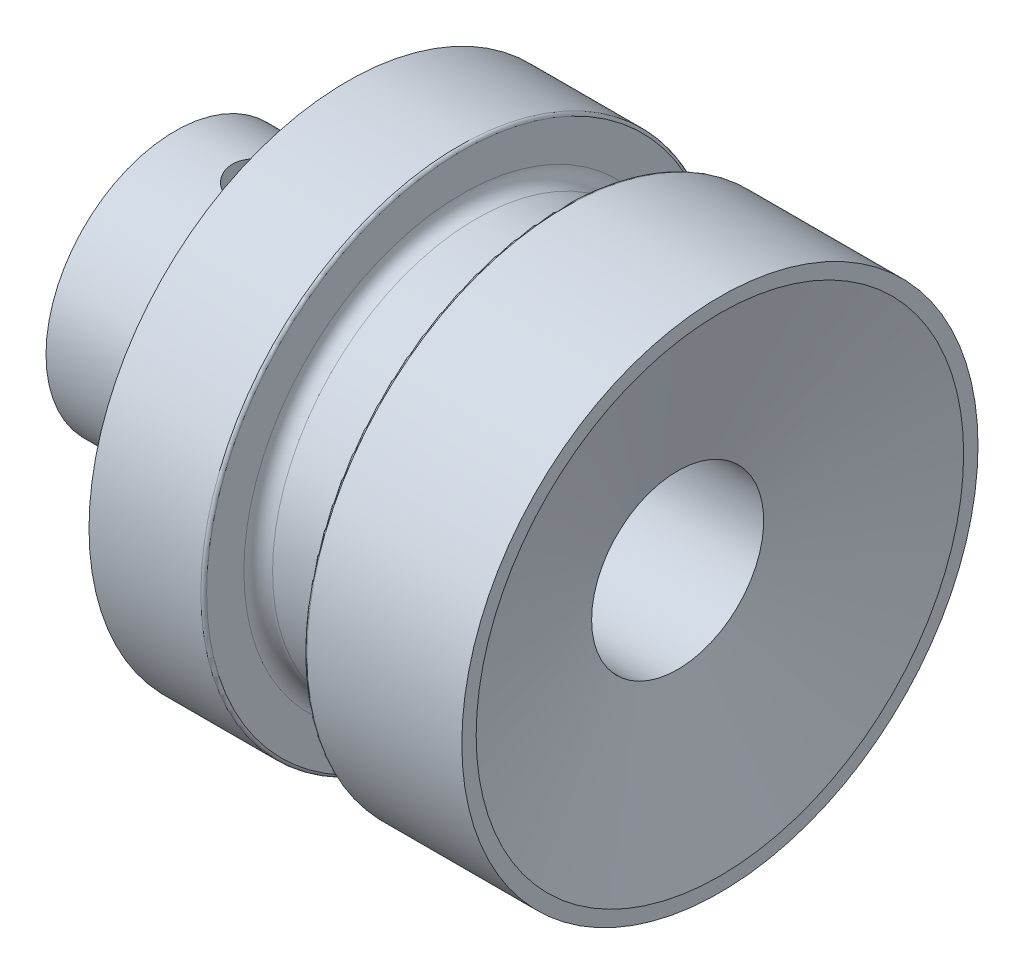
ISO-10303-21;
HEADER;
FILE_DESCRIPTION(('STEP AP214'),'2;1');
FILE_NAME('part.step','',(''),(''),'','','');
FILE_SCHEMA(('AUTOMOTIVE_DESIGN { 1 0 10303 214 1 1 1 1 }'));
ENDSEC;
DATA;
#1=APPLICATION_CONTEXT('core data for automotive mechanical design processes');
#2=APPLICATION_PROTOCOL_DEFINITION('international standard','automotive_design',2000,#1);
#3=PRODUCT_CONTEXT('',#1,'mechanical');
#4=PRODUCT('Part','Part','',(#3));
#5=PRODUCT_RELATED_PRODUCT_CATEGORY('part','',(#4));
#6=PRODUCT_DEFINITION_FORMATION('','',#4);
#7=PRODUCT_DEFINITION_CONTEXT('part definition',#1,'design');
#8=PRODUCT_DEFINITION('design','',#6,#7);
#9=PRODUCT_DEFINITION_SHAPE('','',#8);
#10=(LENGTH_UNIT() NAMED_UNIT(*) SI_UNIT(.MILLI.,.METRE.));
#11=(NAMED_UNIT(*) PLANE_ANGLE_UNIT() SI_UNIT($,.RADIAN.));
#12=(NAMED_UNIT(*) SI_UNIT($,.STERADIAN.) SOLID_ANGLE_UNIT());
#13=UNCERTAINTY_MEASURE_WITH_UNIT(LENGTH_MEASURE(1.E-05),#10,'distance_accuracy_value','');
#14=(GEOMETRIC_REPRESENTATION_CONTEXT(3) GLOBAL_UNCERTAINTY_ASSIGNED_CONTEXT((#13)) GLOBAL_UNIT_ASSIGNED_CONTEXT((#10,
#11,#12)) REPRESENTATION_CONTEXT('',''));
#15=CARTESIAN_POINT('',(0.,0.,0.));
#16=DIRECTION('',(0.,0.,1.));
#17=DIRECTION('',(1.,0.,0.));
#18=AXIS2_PLACEMENT_3D('',#15,#16,#17);
#19=CARTESIAN_POINT('',(0.,0.,0.));
#20=DIRECTION('',(-1.,0.,0.));
#21=DIRECTION('',(0.,0.,1.));
#22=AXIS2_PLACEMENT_3D('',#19,#20,#21);
#23=CYLINDRICAL_SURFACE('',#22,3.);
#24=CARTESIAN_POINT('',(3.,-2.82842712474619,1.));
#25=CARTESIAN_POINT('',(2.94553182518932,-2.82842694532734,1.0000002579478));
#26=CARTESIAN_POINT('',(2.89106520022848,-2.83001769372806,0.99553478369814));
#27=CARTESIAN_POINT('',(2.78374557904938,-2.83617574174579,0.977851131702564));
#28=CARTESIAN_POINT('',(2.73089285013606,-2.8407435316722,0.964631512170673));
#29=CARTESIAN_POINT('',(2.62837310698719,-2.85228203663887,0.929955485680262));
#30=CARTESIAN_POINT('',(2.57870007055312,-2.8592480396464,0.908515221402));
#31=CARTESIAN_POINT('',(2.48363995145621,-2.87479122017007,0.858061628442627));
#32=CARTESIAN_POINT('',(2.4382538174475,-2.88336875305432,0.829046628860522));
#33=CARTESIAN_POINT('',(2.35128003766051,-2.90154489405588,0.763051146442527));
#34=CARTESIAN_POINT('',(2.30988457132796,-2.91116894844138,0.725824341377825));
#35=CARTESIAN_POINT('',(2.23379319877568,-2.93013864801508,0.644987667214489));
#36=CARTESIAN_POINT('',(2.19909836841772,-2.93948424829098,0.601376775052402));
#37=CARTESIAN_POINT('',(2.13652110267032,-2.95713866921658,0.507604507964984));
#38=CARTESIAN_POINT('',(2.10884002938202,-2.96541407701568,0.457301911224518));
#39=CARTESIAN_POINT('',(2.06240841487251,-2.9796958677102,0.352431222987481));
#40=CARTESIAN_POINT('',(2.0436554668231,-2.98570286203011,0.297864285687214));
#41=CARTESIAN_POINT('',(2.0162641453676,-2.99459075431897,0.188028817433492));
#42=CARTESIAN_POINT('',(2.00729655374299,-2.99757314777557,0.132850754852967));
#43=CARTESIAN_POINT('',(1.99868370663934,-3.00043608218249,0.0216978748240909));
#44=CARTESIAN_POINT('',(1.99903604834758,-3.00031742262891,-0.034276733543893));
#45=CARTESIAN_POINT('',(2.00884425456603,-2.99706039618735,-0.143103515193818));
#46=CARTESIAN_POINT('',(2.01794252847451,-2.99404064755135,-0.195992048591667));
#47=CARTESIAN_POINT('',(2.04439298098045,-2.98546967339713,-0.299443438822161));
#48=CARTESIAN_POINT('',(2.06174571897976,-2.97991827631115,-0.350006137779175));
#49=CARTESIAN_POINT('',(2.10442131730613,-2.96675670293291,-0.448152474842013));
#50=CARTESIAN_POINT('',(2.12984593854678,-2.95912042524269,-0.495688220968998));
#51=CARTESIAN_POINT('',(2.18785970544839,-2.94258393038665,-0.585924325527169));
#52=CARTESIAN_POINT('',(2.22045084332664,-2.93368336200518,-0.628623334384769));
#53=CARTESIAN_POINT('',(2.29367439346074,-2.9150619185089,-0.710100866551906));
#54=CARTESIAN_POINT('',(2.33461315784544,-2.90532215172666,-0.748600157067555));
#55=CARTESIAN_POINT('',(2.42244872572266,-2.88647335245111,-0.818277259595889));
#56=CARTESIAN_POINT('',(2.46934644571324,-2.87736441731449,-0.849453943273004));
#57=CARTESIAN_POINT('',(2.56865362561542,-2.86070525135531,-0.903987455042732));
#58=CARTESIAN_POINT('',(2.62113213136781,-2.85317909338821,-0.927226463651049));
#59=CARTESIAN_POINT('',(2.72957139426626,-2.84081650878298,-0.964443193299506));
#60=CARTESIAN_POINT('',(2.78553068122182,-2.83597895501223,-0.978424795755529));
#61=CARTESIAN_POINT('',(2.89663835540062,-2.8297963630207,-0.996161282090474));
#62=CARTESIAN_POINT('',(2.95170942474572,-2.82830360315139,-1.00034909550575));
#63=CARTESIAN_POINT('',(3.06177614911704,-2.828566720628,-0.999605438911604));
#64=CARTESIAN_POINT('',(3.11677181602476,-2.83032200792767,-0.99467562522726));
#65=CARTESIAN_POINT('',(3.22315696571116,-2.83673618089378,-0.97622565155183));
#66=CARTESIAN_POINT('',(3.27460543015064,-2.84129325440593,-0.963006393980555));
#67=CARTESIAN_POINT('',(3.37454360623938,-2.85268553671269,-0.928713862560596));
#68=CARTESIAN_POINT('',(3.42303279159083,-2.85952114934906,-0.907639196363457));
#69=CARTESIAN_POINT('',(3.51738042084694,-2.87496877595717,-0.857474340738901));
#70=CARTESIAN_POINT('',(3.56310664264179,-2.88363025665609,-0.828151118358487));
#71=CARTESIAN_POINT('',(3.64914605238373,-2.90165768730983,-0.762585630557568));
#72=CARTESIAN_POINT('',(3.68945763866122,-2.91102384443799,-0.726341325498785));
#73=CARTESIAN_POINT('',(3.76552798409063,-2.92995038637843,-0.645891705900323));
#74=CARTESIAN_POINT('',(3.80097439001885,-2.93949843577895,-0.601387270546652));
#75=CARTESIAN_POINT('',(3.86391614234804,-2.9572685161311,-0.506827291400258));
#76=CARTESIAN_POINT('',(3.89141177116242,-2.96549059417695,-0.456771944864553));
#77=CARTESIAN_POINT('',(3.93742010486171,-2.97964405810602,-0.352779862432296));
#78=CARTESIAN_POINT('',(3.95599127714806,-2.98559030004531,-0.298871123321197));
#79=CARTESIAN_POINT('',(3.9837277420601,-2.99458610837774,-0.188458465846017));
#80=CARTESIAN_POINT('',(3.9928964298805,-2.99763672034018,-0.13195549195389));
#81=CARTESIAN_POINT('',(4.00126207760564,-3.00041863236257,-0.0208153358600411));
#82=CARTESIAN_POINT('',(4.00090745393238,-3.00029920089441,0.0337847239200186));
#83=CARTESIAN_POINT('',(3.99134269185359,-2.99712196519395,0.142111145000173));
#84=CARTESIAN_POINT('',(3.98213327184724,-2.99406439933567,0.195837576819055));
#85=CARTESIAN_POINT('',(3.95541776542403,-2.9854091495442,0.30004211943206));
#86=CARTESIAN_POINT('',(3.93804578464705,-2.97985258361179,0.350558270912795));
#87=CARTESIAN_POINT('',(3.89562246890286,-2.96677160704464,0.447978350939789));
#88=CARTESIAN_POINT('',(3.87056974480306,-2.959246840479,0.494881624142409));
#89=CARTESIAN_POINT('',(3.81243048789792,-2.94265868828,0.585634016308808));
#90=CARTESIAN_POINT('',(3.77908131461808,-2.93354872492381,0.629306251557695));
#91=CARTESIAN_POINT('',(3.70574260884409,-2.91492988791424,0.710581026272337));
#92=CARTESIAN_POINT('',(3.66575095773832,-2.90542088771397,0.748181621624258));
#93=CARTESIAN_POINT('',(3.57839064441196,-2.88663279827365,0.817741808833463));
#94=CARTESIAN_POINT('',(3.53079448901923,-2.87737727995344,0.849422965999216));
#95=CARTESIAN_POINT('',(3.43066557310135,-2.86060193316303,0.904314343299799));
#96=CARTESIAN_POINT('',(3.37813410698576,-2.85308165136169,0.927526776814558));
#97=CARTESIAN_POINT('',(3.27203817597617,-2.84101334230534,0.963843828206626));
#98=CARTESIAN_POINT('',(3.21862773643428,-2.83634632944799,0.977357909163267));
#99=CARTESIAN_POINT('',(3.11014394948453,-2.83005383613939,0.995434320161694));
#100=CARTESIAN_POINT('',(3.05507118256425,-2.82842730615135,0.999999739196501));
#101=CARTESIAN_POINT('',(3.,-2.82842712474619,1.));
#102=B_SPLINE_CURVE_WITH_KNOTS('',3,(#24,#25,#26,#27,#28,#29,#30,#31,#32,#33,#34,#35,#36,#37,
#38,#39,#40,#41,#42,#43,#44,#45,#46,#47,#48,#49,#50,#51,#52,#53,#54,#55,#56,#57,#58,#59,#60,#61,
#62,#63,#64,#65,#66,#67,#68,#69,#70,#71,#72,#73,#74,#75,#76,#77,#78,#79,#80,#81,#82,#83,#84,#85,
#86,#87,#88,#89,#90,#91,#92,#93,#94,#95,#96,#97,#98,#99,#100,#101),.UNSPECIFIED.,.T.,.F.,(4,2,2,
2,2,2,2,2,2,2,2,2,2,2,2,2,2,2,2,2,2,2,2,2,2,2,2,2,2,2,2,2,2,2,2,2,2,2,4),(0.,0.163200584775416,
0.32642805496888,0.489336627454544,0.652281166139158,0.821013374229397,0.989772651673595,
1.16293506139029,1.33605076382161,1.50314318760306,1.67019253297699,1.83069004820941,
1.99119844184608,2.15381654855707,2.31647991869394,2.48680174359289,2.65714979607478,
2.82992639837376,3.00263051349688,3.16754291357512,3.33242535830307,3.49164395761849,
3.65089079140019,3.81518857728788,3.979534856552,4.15178808164165,4.32403518750605,
4.49513791183924,4.66617882997229,4.82918084670708,4.99216964002854,5.15256956033503,
5.31299850756315,5.47935519513706,5.64576504425704,5.81868902729217,5.99156778259939,
6.15663212153686,6.32163947179229),.UNSPECIFIED.);
#103=CARTESIAN_POINT('',(3.,-2.82842712474619,1.));
#104=VERTEX_POINT('',#103);
#105=EDGE_CURVE('E81',#104,#104,#102,.T.);
#106=ORIENTED_EDGE('',*,*,#105,.T.);
#107=EDGE_LOOP('',(#106));
#108=FACE_BOUND('',#107,.T.);
#109=CARTESIAN_POINT('',(3.,2.82842712474619,1.));
#110=CARTESIAN_POINT('',(3.05446817481068,2.82842694532734,1.0000002579478));
#111=CARTESIAN_POINT('',(3.10893479977153,2.83001769372806,0.99553478369814));
#112=CARTESIAN_POINT('',(3.21625442095062,2.83617574174579,0.977851131702564));
#113=CARTESIAN_POINT('',(3.26910714986394,2.8407435316722,0.964631512170673));
#114=CARTESIAN_POINT('',(3.37162689301281,2.85228203663887,0.929955485680262));
#115=CARTESIAN_POINT('',(3.42129992944688,2.8592480396464,0.908515221402));
#116=CARTESIAN_POINT('',(3.51636004854379,2.87479122017007,0.858061628442627));
#117=CARTESIAN_POINT('',(3.5617461825525,2.88336875305432,0.829046628860522));
#118=CARTESIAN_POINT('',(3.64871996233949,2.90154489405588,0.763051146442527));
#119=CARTESIAN_POINT('',(3.69011542867204,2.91116894844138,0.725824341377825));
#120=CARTESIAN_POINT('',(3.76620680122432,2.93013864801508,0.644987667214489));
#121=CARTESIAN_POINT('',(3.80090163158228,2.93948424829098,0.601376775052402));
#122=CARTESIAN_POINT('',(3.86347889732968,2.95713866921658,0.507604507964984));
#123=CARTESIAN_POINT('',(3.89115997061798,2.96541407701568,0.457301911224518));
#124=CARTESIAN_POINT('',(3.93759158512749,2.9796958677102,0.352431222987481));
#125=CARTESIAN_POINT('',(3.9563445331769,2.98570286203011,0.297864285687214));
#126=CARTESIAN_POINT('',(3.9837358546324,2.99459075431897,0.188028817433492));
#127=CARTESIAN_POINT('',(3.99270344625701,2.99757314777557,0.132850754852967));
#128=CARTESIAN_POINT('',(4.00131629336066,3.00043608218249,0.021697874824091));
#129=CARTESIAN_POINT('',(4.00096395165242,3.00031742262891,-0.0342767335438931));
#130=CARTESIAN_POINT('',(3.99115574543397,2.99706039618735,-0.143103515193817));
#131=CARTESIAN_POINT('',(3.98205747152549,2.99404064755135,-0.195992048591667));
#132=CARTESIAN_POINT('',(3.95560701901955,2.98546967339713,-0.29944343882216));
#133=CARTESIAN_POINT('',(3.93825428102024,2.97991827631115,-0.350006137779175));
#134=CARTESIAN_POINT('',(3.89557868269387,2.96675670293291,-0.448152474842013));
#135=CARTESIAN_POINT('',(3.87015406145322,2.95912042524269,-0.495688220968998));
#136=CARTESIAN_POINT('',(3.81214029455161,2.94258393038665,-0.585924325527169));
#137=CARTESIAN_POINT('',(3.77954915667336,2.93368336200518,-0.628623334384769));
#138=CARTESIAN_POINT('',(3.70632560653926,2.9150619185089,-0.710100866551907));
#139=CARTESIAN_POINT('',(3.66538684215456,2.90532215172666,-0.748600157067556));
#140=CARTESIAN_POINT('',(3.57755127427734,2.88647335245111,-0.81827725959589));
#141=CARTESIAN_POINT('',(3.53065355428676,2.87736441731449,-0.849453943273004));
#142=CARTESIAN_POINT('',(3.43134637438459,2.86070525135531,-0.903987455042732));
#143=CARTESIAN_POINT('',(3.37886786863219,2.85317909338821,-0.927226463651049));
#144=CARTESIAN_POINT('',(3.27042860573374,2.84081650878298,-0.964443193299506));
#145=CARTESIAN_POINT('',(3.21446931877818,2.83597895501223,-0.978424795755529));
#146=CARTESIAN_POINT('',(3.10336164459938,2.8297963630207,-0.996161282090474));
#147=CARTESIAN_POINT('',(3.04829057525428,2.82830360315139,-1.00034909550575));
#148=CARTESIAN_POINT('',(2.93822385088296,2.828566720628,-0.999605438911604));
#149=CARTESIAN_POINT('',(2.88322818397524,2.83032200792767,-0.99467562522726));
#150=CARTESIAN_POINT('',(2.77684303428884,2.83673618089378,-0.97622565155183));
#151=CARTESIAN_POINT('',(2.72539456984936,2.84129325440593,-0.963006393980555));
#152=CARTESIAN_POINT('',(2.62545639376062,2.85268553671269,-0.928713862560596));
#153=CARTESIAN_POINT('',(2.57696720840917,2.85952114934906,-0.907639196363457));
#154=CARTESIAN_POINT('',(2.48261957915306,2.87496877595717,-0.857474340738901));
#155=CARTESIAN_POINT('',(2.43689335735821,2.88363025665609,-0.828151118358487));
#156=CARTESIAN_POINT('',(2.35085394761627,2.90165768730983,-0.762585630557568));
#157=CARTESIAN_POINT('',(2.31054236133878,2.91102384443799,-0.726341325498785));
#158=CARTESIAN_POINT('',(2.23447201590937,2.92995038637843,-0.645891705900323));
#159=CARTESIAN_POINT('',(2.19902560998115,2.93949843577895,-0.601387270546652));
#160=CARTESIAN_POINT('',(2.13608385765196,2.9572685161311,-0.506827291400258));
#161=CARTESIAN_POINT('',(2.10858822883758,2.96549059417695,-0.456771944864553));
#162=CARTESIAN_POINT('',(2.06257989513829,2.97964405810602,-0.352779862432296));
#163=CARTESIAN_POINT('',(2.04400872285194,2.98559030004531,-0.298871123321197));
#164=CARTESIAN_POINT('',(2.0162722579399,2.99458610837774,-0.188458465846017));
#165=CARTESIAN_POINT('',(2.0071035701195,2.99763672034018,-0.13195549195389));
#166=CARTESIAN_POINT('',(1.99873792239436,3.00041863236257,-0.0208153358600414));
#167=CARTESIAN_POINT('',(1.99909254606762,3.00029920089441,0.0337847239200183));
#168=CARTESIAN_POINT('',(2.00865730814641,2.99712196519395,0.142111145000173));
#169=CARTESIAN_POINT('',(2.01786672815276,2.99406439933567,0.195837576819054));
#170=CARTESIAN_POINT('',(2.04458223457597,2.9854091495442,0.30004211943206));
#171=CARTESIAN_POINT('',(2.06195421535295,2.97985258361179,0.350558270912794));
#172=CARTESIAN_POINT('',(2.10437753109714,2.96677160704464,0.447978350939789));
#173=CARTESIAN_POINT('',(2.12943025519694,2.959246840479,0.494881624142409));
#174=CARTESIAN_POINT('',(2.18756951210208,2.94265868828,0.585634016308808));
#175=CARTESIAN_POINT('',(2.22091868538192,2.93354872492381,0.629306251557695));
#176=CARTESIAN_POINT('',(2.29425739115591,2.91492988791424,0.710581026272337));
#177=CARTESIAN_POINT('',(2.33424904226168,2.90542088771397,0.748181621624258));
#178=CARTESIAN_POINT('',(2.42160935558803,2.88663279827365,0.817741808833463));
#179=CARTESIAN_POINT('',(2.46920551098077,2.87737727995344,0.849422965999216));
#180=CARTESIAN_POINT('',(2.56933442689865,2.86060193316303,0.904314343299799));
#181=CARTESIAN_POINT('',(2.62186589301424,2.85308165136169,0.927526776814558));
#182=CARTESIAN_POINT('',(2.72796182402383,2.84101334230534,0.963843828206626));
#183=CARTESIAN_POINT('',(2.78137226356572,2.83634632944799,0.977357909163267));
#184=CARTESIAN_POINT('',(2.88985605051547,2.83005383613939,0.995434320161694));
#185=CARTESIAN_POINT('',(2.94492881743575,2.82842730615135,0.999999739196501));
#186=CARTESIAN_POINT('',(3.,2.82842712474619,1.));
#187=B_SPLINE_CURVE_WITH_KNOTS('',3,(#109,#110,#111,#112,#113,#114,#115,#116,#117,#118,#119,
#120,#121,#122,#123,#124,#125,#126,#127,#128,#129,#130,#131,#132,#133,#134,#135,#136,#137,#138,
#139,#140,#141,#142,#143,#144,#145,#146,#147,#148,#149,#150,#151,#152,#153,#154,#155,#156,#157,
#158,#159,#160,#161,#162,#163,#164,#165,#166,#167,#168,#169,#170,#171,#172,#173,#174,#175,#176,
#177,#178,#179,#180,#181,#182,#183,#184,#185,#186),.UNSPECIFIED.,.T.,.F.,(4,2,2,2,2,2,2,2,2,2,2,
2,2,2,2,2,2,2,2,2,2,2,2,2,2,2,2,2,2,2,2,2,2,2,2,2,2,2,4),(0.,0.163200584775416,0.32642805496888,
0.489336627454544,0.652281166139158,0.821013374229397,0.989772651673595,1.16293506139029,
1.33605076382161,1.50314318760306,1.67019253297699,1.83069004820941,1.99119844184608,
2.15381654855707,2.31647991869394,2.48680174359289,2.65714979607477,2.82992639837376,
3.00263051349688,3.16754291357512,3.33242535830307,3.49164395761849,3.65089079140018,
3.81518857728788,3.979534856552,4.15178808164165,4.32403518750605,4.49513791183924,
4.66617882997229,4.82918084670708,4.99216964002854,5.15256956033502,5.31299850756315,
5.47935519513706,5.64576504425704,5.81868902729217,5.99156778259939,6.15663212153685,
6.32163947179229),.UNSPECIFIED.);
#188=CARTESIAN_POINT('',(3.,2.82842712474619,1.));
#189=VERTEX_POINT('',#188);
#190=EDGE_CURVE('E76',#189,#189,#187,.T.);
#191=ORIENTED_EDGE('',*,*,#190,.T.);
#192=EDGE_LOOP('',(#191));
#193=FACE_BOUND('',#192,.T.);
#194=CARTESIAN_POINT('',(17.5262794416288,0.,0.));
#195=DIRECTION('',(-1.,0.,0.));
#196=DIRECTION('',(0.,0.,1.));
#197=AXIS2_PLACEMENT_3D('',#194,#195,#196);
#198=CIRCLE('',#197,3.);
#199=CARTESIAN_POINT('',(17.5262794416288,0.,3.));
#200=VERTEX_POINT('',#199);
#201=EDGE_CURVE('E87',#200,#200,#198,.T.);
#202=ORIENTED_EDGE('',*,*,#201,.F.);
#203=EDGE_LOOP('',(#202));
#204=FACE_BOUND('',#203,.T.);
#205=CARTESIAN_POINT('',(0.,0.,0.));
#206=DIRECTION('',(-1.,0.,0.));
#207=DIRECTION('',(0.,0.,1.));
#208=AXIS2_PLACEMENT_3D('',#205,#206,#207);
#209=CIRCLE('',#208,2.99999999999999);
#210=CARTESIAN_POINT('',(0.,0.,2.99999999999999));
#211=VERTEX_POINT('',#210);
#212=EDGE_CURVE('E10',#211,#211,#209,.T.);
#213=ORIENTED_EDGE('',*,*,#212,.T.);
#214=EDGE_LOOP('',(#213));
#215=FACE_BOUND('',#214,.T.);
#216=ADVANCED_FACE('F34',(#108,#193,#204,#215),#23,.F.);
#217=CARTESIAN_POINT('',(0.,2.99999999999999,0.));
#218=DIRECTION('',(1.,0.,0.));
#219=DIRECTION('',(0.,0.,-1.));
#220=AXIS2_PLACEMENT_3D('',#217,#218,#219);
#221=PLANE('',#220);
#222=ORIENTED_EDGE('',*,*,#212,.F.);
#223=EDGE_LOOP('',(#222));
#224=FACE_BOUND('',#223,.T.);
#225=CARTESIAN_POINT('',(0.,0.,0.));
#226=DIRECTION('',(-1.,0.,0.));
#227=DIRECTION('',(0.,0.,1.));
#228=AXIS2_PLACEMENT_3D('',#225,#226,#227);
#229=CIRCLE('',#228,4.5);
#230=CARTESIAN_POINT('',(0.,0.,4.5));
#231=VERTEX_POINT('',#230);
#232=EDGE_CURVE('E47',#231,#231,#229,.T.);
#233=ORIENTED_EDGE('',*,*,#232,.T.);
#234=EDGE_LOOP('',(#233));
#235=FACE_BOUND('',#234,.T.);
#236=ADVANCED_FACE('F195',(#224,#235),#221,.F.);
#237=CARTESIAN_POINT('',(0.,0.,0.));
#238=DIRECTION('',(-1.,0.,0.));
#239=DIRECTION('',(0.,0.,1.));
#240=AXIS2_PLACEMENT_3D('',#237,#238,#239);
#241=CYLINDRICAL_SURFACE('',#240,4.5);
#242=CARTESIAN_POINT('',(3.,-4.38748219369606,1.));
#243=CARTESIAN_POINT('',(3.05542118384673,-4.38748331342391,0.999998124740785));
#244=CARTESIAN_POINT('',(3.11086470629648,-4.38854372765849,0.995377065735324));
#245=CARTESIAN_POINT('',(3.2201734130143,-4.39266269613714,0.97703611833839));
#246=CARTESIAN_POINT('',(3.27403745170201,-4.39572266492455,0.963309788508038));
#247=CARTESIAN_POINT('',(3.37859021114546,-4.40347746164853,0.927213191558881));
#248=CARTESIAN_POINT('',(3.42928240700305,-4.40817046205988,0.904852584002374));
#249=CARTESIAN_POINT('',(3.52619750352572,-4.41866033160417,0.852150017177229));
#250=CARTESIAN_POINT('',(3.5724204658707,-4.42445718549953,0.821808168079243));
#251=CARTESIAN_POINT('',(3.65989128568498,-4.43661451639959,0.753440537295431));
#252=CARTESIAN_POINT('',(3.70104988106007,-4.44298239912488,0.715301848896048));
#253=CARTESIAN_POINT('',(3.77644137621931,-4.45549951724043,0.632666839431873));
#254=CARTESIAN_POINT('',(3.81067372682177,-4.46164873526094,0.588170014707602));
#255=CARTESIAN_POINT('',(3.87159537569772,-4.47311646400737,0.493481972618769));
#256=CARTESIAN_POINT('',(3.89819862472658,-4.47842521703683,0.443234108266534));
#257=CARTESIAN_POINT('',(3.94254990086023,-4.48753012167776,0.338843167825976));
#258=CARTESIAN_POINT('',(3.9602989542355,-4.49132644858096,0.284700544003477));
#259=CARTESIAN_POINT('',(3.98615671646943,-4.49692642233618,0.174985398164167));
#260=CARTESIAN_POINT('',(3.9944165546002,-4.49876127463464,0.119450114130961));
#261=CARTESIAN_POINT('',(4.00153413543621,-4.50033974476022,0.00775382889301164));
#262=CARTESIAN_POINT('',(4.00039298696691,-4.50008360921472,-0.0484070977382725));
#263=CARTESIAN_POINT('',(3.98885313875198,-4.4975327467564,-0.158717960467174));
#264=CARTESIAN_POINT('',(3.97861736045445,-4.49527389802337,-0.212885892163576));
#265=CARTESIAN_POINT('',(3.94943866622242,-4.48901238651153,-0.318715422771708));
#266=CARTESIAN_POINT('',(3.93049534837337,-4.48500964324008,-0.370376905871404));
#267=CARTESIAN_POINT('',(3.88429651294953,-4.47565269302828,-0.470176884695465));
#268=CARTESIAN_POINT('',(3.85697964172778,-4.47028856276396,-0.518286010447011));
#269=CARTESIAN_POINT('',(3.7948549530255,-4.45879635842009,-0.609296568272403));
#270=CARTESIAN_POINT('',(3.76004608446502,-4.4526681771998,-0.652197268314768));
#271=CARTESIAN_POINT('',(3.68303990307352,-4.44016582863413,-0.732542494790414));
#272=CARTESIAN_POINT('',(3.64070001201458,-4.43378920480069,-0.769850109238106));
#273=CARTESIAN_POINT('',(3.55029862619146,-4.42163160720916,-0.836861515102731));
#274=CARTESIAN_POINT('',(3.50223696611286,-4.41585065067021,-0.866565086744066));
#275=CARTESIAN_POINT('',(3.40153005582566,-4.40553216782545,-0.91758882957986));
#276=CARTESIAN_POINT('',(3.34887088859767,-4.4009986024148,-0.93888238720365));
#277=CARTESIAN_POINT('',(3.24059691435886,-4.39374257045182,-0.97227634761584));
#278=CARTESIAN_POINT('',(3.18498259457134,-4.39101980634257,-0.984378260852373));
#279=CARTESIAN_POINT('',(3.07363000647013,-4.38775454247314,-0.998831494501015));
#280=CARTESIAN_POINT('',(3.01791893448007,-4.3871674012543,-1.00138249383898));
#281=CARTESIAN_POINT('',(2.90686753851872,-4.38811932262746,-0.997202737121733));
#282=CARTESIAN_POINT('',(2.85152718847078,-4.38965823406047,-0.990472640937895));
#283=CARTESIAN_POINT('',(2.74348823125171,-4.39464664137563,-0.968095186613481));
#284=CARTESIAN_POINT('',(2.69076551235185,-4.39807241834516,-0.952558463272168));
#285=CARTESIAN_POINT('',(2.58867168443566,-4.40642704252923,-0.913128875693618));
#286=CARTESIAN_POINT('',(2.53930090525027,-4.41135603739913,-0.889235190550064));
#287=CARTESIAN_POINT('',(2.44445019911179,-4.42225937025823,-0.833332350832739));
#288=CARTESIAN_POINT('',(2.39904434250747,-4.42824903821989,-0.801200572354219));
#289=CARTESIAN_POINT('',(2.31419582129565,-4.44055871006593,-0.729893521468862));
#290=CARTESIAN_POINT('',(2.27475392348571,-4.44687875628735,-0.690717344765467));
#291=CARTESIAN_POINT('',(2.2021743282457,-4.45928466963624,-0.605528607307309));
#292=CARTESIAN_POINT('',(2.16917298206527,-4.46536366365756,-0.559398704918137));
#293=CARTESIAN_POINT('',(2.11138793288299,-4.47647455721721,-0.462134081071294));
#294=CARTESIAN_POINT('',(2.08660383968328,-4.48150650647044,-0.410999597406531));
#295=CARTESIAN_POINT('',(2.0461449426833,-4.48992744359791,-0.305500950001647));
#296=CARTESIAN_POINT('',(2.03041140205292,-4.49332700109296,-0.251160194087202));
#297=CARTESIAN_POINT('',(2.00831741999173,-4.49814588349754,-0.140522543397796));
#298=CARTESIAN_POINT('',(2.00195556964307,-4.49956550606413,-0.0842259439625959));
#299=CARTESIAN_POINT('',(1.99885060881552,-4.50025537600146,0.027432422770189));
#300=CARTESIAN_POINT('',(2.00190418467039,-4.49957105615266,0.0827883528681088));
#301=CARTESIAN_POINT('',(2.01708747527836,-4.49622763231539,0.192177020683065));
#302=CARTESIAN_POINT('',(2.02921701654745,-4.49356856607353,0.246209783671607));
#303=CARTESIAN_POINT('',(2.06210917859742,-4.48657818532304,0.351255142393358));
#304=CARTESIAN_POINT('',(2.08284211195059,-4.48225262496609,0.40227744132041));
#305=CARTESIAN_POINT('',(2.13232390176949,-4.47239043658606,0.500145764046379));
#306=CARTESIAN_POINT('',(2.16107356308923,-4.46685368697546,0.546991367894834));
#307=CARTESIAN_POINT('',(2.22643113873243,-4.45503741308905,0.636165449755516));
#308=CARTESIAN_POINT('',(2.26318151784809,-4.44874549747429,0.678387879198455));
#309=CARTESIAN_POINT('',(2.34321106822281,-4.43619353584561,0.756135866174557));
#310=CARTESIAN_POINT('',(2.38649181788245,-4.42993349791575,0.791659799988316));
#311=CARTESIAN_POINT('',(2.47907724990508,-4.4180568509948,0.855479255716282));
#312=CARTESIAN_POINT('',(2.52845730841477,-4.41245039614391,0.883667429316083));
#313=CARTESIAN_POINT('',(2.63136844773064,-4.402644201522,0.931300131649453));
#314=CARTESIAN_POINT('',(2.6848960220652,-4.3984432890926,0.950751953872793));
#315=CARTESIAN_POINT('',(2.78205323701998,-4.39268810860696,0.976946747324326));
#316=CARTESIAN_POINT('',(2.82516171363364,-4.3907490225869,0.985574910239044));
#317=CARTESIAN_POINT('',(2.91217547829319,-4.38814565456081,0.997102130853924));
#318=CARTESIAN_POINT('',(2.95608072483999,-4.38748130635241,1.00000148607481));
#319=CARTESIAN_POINT('',(3.,-4.38748219369606,1.));
#320=B_SPLINE_CURVE_WITH_KNOTS('',3,(#242,#243,#244,#245,#246,#247,#248,#249,#250,#251,#252,
#253,#254,#255,#256,#257,#258,#259,#260,#261,#262,#263,#264,#265,#266,#267,#268,#269,#270,#271,
#272,#273,#274,#275,#276,#277,#278,#279,#280,#281,#282,#283,#284,#285,#286,#287,#288,#289,#290,
#291,#292,#293,#294,#295,#296,#297,#298,#299,#300,#301,#302,#303,#304,#305,#306,#307,#308,#309,
#310,#311,#312,#313,#314,#315,#316,#317,#318,#319),.UNSPECIFIED.,.T.,.F.,(4,2,2,2,2,2,2,2,2,2,2,
2,2,2,2,2,2,2,2,2,2,2,2,2,2,2,2,2,2,2,2,2,2,2,2,2,2,2,4),(0.,0.166102558494591,
0.332322750192435,0.498357520008391,0.664389998050727,0.833022969567701,1.00166930675099,
1.17214906318353,1.34260905508582,1.51031485736443,1.67800087939989,1.84274220917405,
2.00749114368964,2.17347729000196,2.33948673831992,2.50906023645939,2.67863863513816,
2.84874944722111,3.01883229921634,3.18533874755266,3.35183335815117,3.51628128972296,
3.68074537959259,3.84781614360498,4.01490836999235,4.18522523018715,4.35553400169376,
4.52472464724766,4.6938898544815,4.85942793779578,5.02496285698629,5.18993125886616,
5.35491622901636,5.52312234724343,5.69136918646788,5.86195485764065,6.03239785047427,
6.16403493145229,6.29566517579135),.UNSPECIFIED.);
#321=CARTESIAN_POINT('',(3.,-4.38748219369606,1.));
#322=VERTEX_POINT('',#321);
#323=EDGE_CURVE('E38',#322,#322,#320,.T.);
#324=ORIENTED_EDGE('',*,*,#323,.T.);
#325=EDGE_LOOP('',(#324));
#326=FACE_BOUND('',#325,.T.);
#327=CARTESIAN_POINT('',(3.,4.38748219369606,1.));
#328=CARTESIAN_POINT('',(2.94457881615327,4.38748331342391,0.999998124740785));
#329=CARTESIAN_POINT('',(2.88913529370352,4.38854372765849,0.995377065735324));
#330=CARTESIAN_POINT('',(2.7798265869857,4.39266269613714,0.97703611833839));
#331=CARTESIAN_POINT('',(2.725962548298,4.39572266492455,0.963309788508038));
#332=CARTESIAN_POINT('',(2.62140978885454,4.40347746164853,0.927213191558881));
#333=CARTESIAN_POINT('',(2.57071759299695,4.40817046205988,0.904852584002374));
#334=CARTESIAN_POINT('',(2.47380249647428,4.41866033160417,0.852150017177229));
#335=CARTESIAN_POINT('',(2.4275795341293,4.42445718549954,0.821808168079242));
#336=CARTESIAN_POINT('',(2.34010871431502,4.43661451639959,0.753440537295431));
#337=CARTESIAN_POINT('',(2.29895011893993,4.44298239912488,0.715301848896048));
#338=CARTESIAN_POINT('',(2.22355862378069,4.45549951724043,0.632666839431873));
#339=CARTESIAN_POINT('',(2.18932627317823,4.46164873526093,0.588170014707602));
#340=CARTESIAN_POINT('',(2.12840462430228,4.47311646400737,0.493481972618769));
#341=CARTESIAN_POINT('',(2.10180137527342,4.47842521703683,0.443234108266534));
#342=CARTESIAN_POINT('',(2.05745009913977,4.48753012167776,0.338843167825975));
#343=CARTESIAN_POINT('',(2.0397010457645,4.49132644858096,0.284700544003477));
#344=CARTESIAN_POINT('',(2.01384328353057,4.49692642233618,0.174985398164166));
#345=CARTESIAN_POINT('',(2.0055834453998,4.49876127463464,0.119450114130961));
#346=CARTESIAN_POINT('',(1.99846586456379,4.50033974476022,0.00775382889301179));
#347=CARTESIAN_POINT('',(1.99960701303309,4.50008360921472,-0.0484070977382724));
#348=CARTESIAN_POINT('',(2.01114686124802,4.4975327467564,-0.158717960467173));
#349=CARTESIAN_POINT('',(2.02138263954555,4.49527389802337,-0.212885892163576));
#350=CARTESIAN_POINT('',(2.05056133377758,4.48901238651153,-0.318715422771708));
#351=CARTESIAN_POINT('',(2.06950465162663,4.48500964324008,-0.370376905871404));
#352=CARTESIAN_POINT('',(2.11570348705047,4.47565269302828,-0.470176884695466));
#353=CARTESIAN_POINT('',(2.14302035827222,4.47028856276396,-0.518286010447011));
#354=CARTESIAN_POINT('',(2.2051450469745,4.45879635842009,-0.609296568272403));
#355=CARTESIAN_POINT('',(2.23995391553498,4.4526681771998,-0.652197268314768));
#356=CARTESIAN_POINT('',(2.31696009692648,4.44016582863413,-0.732542494790414));
#357=CARTESIAN_POINT('',(2.35929998798542,4.43378920480069,-0.769850109238106));
#358=CARTESIAN_POINT('',(2.44970137380854,4.42163160720916,-0.836861515102731));
#359=CARTESIAN_POINT('',(2.49776303388714,4.41585065067021,-0.866565086744066));
#360=CARTESIAN_POINT('',(2.59846994417434,4.40553216782545,-0.91758882957986));
#361=CARTESIAN_POINT('',(2.65112911140233,4.4009986024148,-0.93888238720365));
#362=CARTESIAN_POINT('',(2.75940308564114,4.39374257045182,-0.97227634761584));
#363=CARTESIAN_POINT('',(2.81501740542866,4.39101980634257,-0.984378260852373));
#364=CARTESIAN_POINT('',(2.92636999352987,4.38775454247314,-0.998831494501015));
#365=CARTESIAN_POINT('',(2.98208106551993,4.3871674012543,-1.00138249383898));
#366=CARTESIAN_POINT('',(3.09313246148128,4.38811932262746,-0.997202737121733));
#367=CARTESIAN_POINT('',(3.14847281152922,4.38965823406047,-0.990472640937895));
#368=CARTESIAN_POINT('',(3.25651176874829,4.39464664137563,-0.968095186613481));
#369=CARTESIAN_POINT('',(3.30923448764815,4.39807241834516,-0.952558463272168));
#370=CARTESIAN_POINT('',(3.41132831556434,4.40642704252923,-0.913128875693618));
#371=CARTESIAN_POINT('',(3.46069909474973,4.41135603739913,-0.889235190550063));
#372=CARTESIAN_POINT('',(3.55554980088821,4.42225937025823,-0.833332350832739));
#373=CARTESIAN_POINT('',(3.60095565749253,4.42824903821989,-0.801200572354218));
#374=CARTESIAN_POINT('',(3.68580417870435,4.44055871006593,-0.729893521468861));
#375=CARTESIAN_POINT('',(3.72524607651429,4.44687875628735,-0.690717344765467));
#376=CARTESIAN_POINT('',(3.7978256717543,4.45928466963624,-0.605528607307309));
#377=CARTESIAN_POINT('',(3.83082701793473,4.46536366365756,-0.559398704918137));
#378=CARTESIAN_POINT('',(3.88861206711701,4.47647455721721,-0.462134081071294));
#379=CARTESIAN_POINT('',(3.91339616031672,4.48150650647044,-0.410999597406531));
#380=CARTESIAN_POINT('',(3.9538550573167,4.48992744359791,-0.305500950001647));
#381=CARTESIAN_POINT('',(3.96958859794708,4.49332700109296,-0.251160194087202));
#382=CARTESIAN_POINT('',(3.99168258000827,4.49814588349754,-0.140522543397796));
#383=CARTESIAN_POINT('',(3.99804443035693,4.49956550606413,-0.084225943962596));
#384=CARTESIAN_POINT('',(4.00114939118448,4.50025537600146,0.0274324227701888));
#385=CARTESIAN_POINT('',(3.99809581532961,4.49957105615266,0.0827883528681086));
#386=CARTESIAN_POINT('',(3.98291252472164,4.49622763231539,0.192177020683065));
#387=CARTESIAN_POINT('',(3.97078298345254,4.49356856607353,0.246209783671607));
#388=CARTESIAN_POINT('',(3.93789082140258,4.48657818532304,0.351255142393358));
#389=CARTESIAN_POINT('',(3.91715788804941,4.48225262496609,0.40227744132041));
#390=CARTESIAN_POINT('',(3.86767609823051,4.47239043658606,0.500145764046379));
#391=CARTESIAN_POINT('',(3.83892643691077,4.46685368697546,0.546991367894834));
#392=CARTESIAN_POINT('',(3.77356886126757,4.45503741308905,0.636165449755516));
#393=CARTESIAN_POINT('',(3.73681848215191,4.44874549747429,0.678387879198455));
#394=CARTESIAN_POINT('',(3.65678893177719,4.43619353584561,0.756135866174557));
#395=CARTESIAN_POINT('',(3.61350818211755,4.42993349791575,0.791659799988316));
#396=CARTESIAN_POINT('',(3.52092275009492,4.4180568509948,0.855479255716282));
#397=CARTESIAN_POINT('',(3.47154269158522,4.41245039614391,0.883667429316083));
#398=CARTESIAN_POINT('',(3.36863155226936,4.402644201522,0.931300131649453));
#399=CARTESIAN_POINT('',(3.3151039779348,4.3984432890926,0.950751953872793));
#400=CARTESIAN_POINT('',(3.21794676298002,4.39268810860696,0.976946747324326));
#401=CARTESIAN_POINT('',(3.17483828636636,4.3907490225869,0.985574910239044));
#402=CARTESIAN_POINT('',(3.08782452170681,4.38814565456081,0.997102130853923));
#403=CARTESIAN_POINT('',(3.04391927516001,4.38748130635241,1.00000148607481));
#404=CARTESIAN_POINT('',(3.,4.38748219369606,1.));
#405=B_SPLINE_CURVE_WITH_KNOTS('',3,(#327,#328,#329,#330,#331,#332,#333,#334,#335,#336,#337,
#338,#339,#340,#341,#342,#343,#344,#345,#346,#347,#348,#349,#350,#351,#352,#353,#354,#355,#356,
#357,#358,#359,#360,#361,#362,#363,#364,#365,#366,#367,#368,#369,#370,#371,#372,#373,#374,#375,
#376,#377,#378,#379,#380,#381,#382,#383,#384,#385,#386,#387,#388,#389,#390,#391,#392,#393,#394,
#395,#396,#397,#398,#399,#400,#401,#402,#403,#404),.UNSPECIFIED.,.T.,.F.,(4,2,2,2,2,2,2,2,2,2,2,
2,2,2,2,2,2,2,2,2,2,2,2,2,2,2,2,2,2,2,2,2,2,2,2,2,2,2,4),(0.,0.16610255849459,0.332322750192435,
0.498357520008392,0.664389998050727,0.833022969567701,1.00166930675099,1.17214906318353,
1.34260905508582,1.51031485736443,1.67800087939989,1.84274220917405,2.00749114368964,
2.17347729000196,2.33948673831992,2.50906023645939,2.67863863513816,2.84874944722111,
3.01883229921634,3.18533874755265,3.35183335815117,3.51628128972296,3.68074537959259,
3.84781614360498,4.01490836999235,4.18522523018715,4.35553400169376,4.52472464724766,
4.6938898544815,4.85942793779578,5.02496285698629,5.18993125886616,5.35491622901636,
5.52312234724343,5.69136918646788,5.86195485764065,6.03239785047427,6.16403493145229,
6.29566517579135),.UNSPECIFIED.);
#406=CARTESIAN_POINT('',(3.,4.38748219369606,1.));
#407=VERTEX_POINT('',#406);
#408=EDGE_CURVE('E55',#407,#407,#405,.T.);
#409=ORIENTED_EDGE('',*,*,#408,.T.);
#410=EDGE_LOOP('',(#409));
#411=FACE_BOUND('',#410,.T.);
#412=ORIENTED_EDGE('',*,*,#232,.F.);
#413=EDGE_LOOP('',(#412));
#414=FACE_BOUND('',#413,.T.);
#415=CARTESIAN_POINT('',(6.,0.,0.));
#416=DIRECTION('',(-1.,0.,0.));
#417=DIRECTION('',(0.,0.,1.));
#418=AXIS2_PLACEMENT_3D('',#415,#416,#417);
#419=CIRCLE('',#418,4.5);
#420=CARTESIAN_POINT('',(6.,0.,4.5));
#421=VERTEX_POINT('',#420);
#422=EDGE_CURVE('E52',#421,#421,#419,.T.);
#423=ORIENTED_EDGE('',*,*,#422,.T.);
#424=EDGE_LOOP('',(#423));
#425=FACE_BOUND('',#424,.T.);
#426=ADVANCED_FACE('F60',(#326,#411,#414,#425),#241,.T.);
#427=CARTESIAN_POINT('',(6.,4.5,0.));
#428=DIRECTION('',(1.,0.,0.));
#429=DIRECTION('',(0.,0.,-1.));
#430=AXIS2_PLACEMENT_3D('',#427,#428,#429);
#431=PLANE('',#430);
#432=ORIENTED_EDGE('',*,*,#422,.F.);
#433=EDGE_LOOP('',(#432));
#434=FACE_BOUND('',#433,.T.);
#435=CARTESIAN_POINT('',(6.,0.,0.));
#436=DIRECTION('',(-1.,0.,0.));
#437=DIRECTION('',(0.,0.,1.));
#438=AXIS2_PLACEMENT_3D('',#435,#436,#437);
#439=CIRCLE('',#438,9.);
#440=CARTESIAN_POINT('',(6.,0.,9.));
#441=VERTEX_POINT('',#440);
#442=EDGE_CURVE('E120',#441,#441,#439,.T.);
#443=ORIENTED_EDGE('',*,*,#442,.T.);
#444=EDGE_LOOP('',(#443));
#445=FACE_BOUND('',#444,.T.);
#446=ADVANCED_FACE('F126',(#434,#445),#431,.F.);
#447=CARTESIAN_POINT('',(0.,0.,0.));
#448=DIRECTION('',(-1.,0.,0.));
#449=DIRECTION('',(0.,0.,1.));
#450=AXIS2_PLACEMENT_3D('',#447,#448,#449);
#451=CYLINDRICAL_SURFACE('',#450,9.);
#452=ORIENTED_EDGE('',*,*,#442,.F.);
#453=EDGE_LOOP('',(#452));
#454=FACE_BOUND('',#453,.T.);
#455=CARTESIAN_POINT('',(9.9,0.,0.));
#456=DIRECTION('',(-1.,0.,0.));
#457=DIRECTION('',(0.,0.,1.));
#458=AXIS2_PLACEMENT_3D('',#455,#456,#457);
#459=CIRCLE('',#458,9.);
#460=CARTESIAN_POINT('',(9.9,0.,9.));
#461=VERTEX_POINT('',#460);
#462=EDGE_CURVE('E117',#461,#461,#459,.T.);
#463=ORIENTED_EDGE('',*,*,#462,.T.);
#464=EDGE_LOOP('',(#463));
#465=FACE_BOUND('',#464,.T.);
#466=ADVANCED_FACE('F129',(#454,#465),#451,.T.);
#467=CARTESIAN_POINT('',(9.9,0.,0.));
#468=DIRECTION('',(-1.,0.,0.));
#469=DIRECTION('',(0.,0.,1.));
#470=AXIS2_PLACEMENT_3D('',#467,#468,#469);
#471=TOROIDAL_SURFACE('',#470,8.9,0.0999999999999994);
#472=ORIENTED_EDGE('',*,*,#462,.F.);
#473=EDGE_LOOP('',(#472));
#474=FACE_BOUND('',#473,.T.);
#475=CARTESIAN_POINT('',(10.,0.,0.));
#476=DIRECTION('',(-1.,0.,0.));
#477=DIRECTION('',(0.,0.,1.));
#478=AXIS2_PLACEMENT_3D('',#475,#476,#477);
#479=CIRCLE('',#478,8.9);
#480=CARTESIAN_POINT('',(10.,0.,8.9));
#481=VERTEX_POINT('',#480);
#482=EDGE_CURVE('E114',#481,#481,#479,.T.);
#483=ORIENTED_EDGE('',*,*,#482,.T.);
#484=EDGE_LOOP('',(#483));
#485=FACE_BOUND('',#484,.T.);
#486=ADVANCED_FACE('F134',(#474,#485),#471,.T.);
#487=CARTESIAN_POINT('',(10.,8.9,0.));
#488=DIRECTION('',(-1.,0.,0.));
#489=DIRECTION('',(0.,0.,1.));
#490=AXIS2_PLACEMENT_3D('',#487,#488,#489);
#491=PLANE('',#490);
#492=ORIENTED_EDGE('',*,*,#482,.F.);
#493=EDGE_LOOP('',(#492));
#494=FACE_BOUND('',#493,.T.);
#495=CARTESIAN_POINT('',(10.,0.,0.));
#496=DIRECTION('',(-1.,0.,0.));
#497=DIRECTION('',(0.,0.,1.));
#498=AXIS2_PLACEMENT_3D('',#495,#496,#497);
#499=CIRCLE('',#498,7.6);
#500=CARTESIAN_POINT('',(10.,0.,7.6));
#501=VERTEX_POINT('',#500);
#502=EDGE_CURVE('E111',#501,#501,#499,.T.);
#503=ORIENTED_EDGE('',*,*,#502,.T.);
#504=EDGE_LOOP('',(#503));
#505=FACE_BOUND('',#504,.T.);
#506=ADVANCED_FACE('F140',(#494,#505),#491,.F.);
#507=CARTESIAN_POINT('',(10.5,0.,0.));
#508=DIRECTION('',(-1.,0.,0.));
#509=DIRECTION('',(0.,0.,1.));
#510=AXIS2_PLACEMENT_3D('',#507,#508,#509);
#511=TOROIDAL_SURFACE('',#510,7.6,0.5);
#512=ORIENTED_EDGE('',*,*,#502,.F.);
#513=EDGE_LOOP('',(#512));
#514=FACE_BOUND('',#513,.T.);
#515=CARTESIAN_POINT('',(10.5,0.,0.));
#516=DIRECTION('',(-1.,0.,0.));
#517=DIRECTION('',(0.,0.,1.));
#518=AXIS2_PLACEMENT_3D('',#515,#516,#517);
#519=CIRCLE('',#518,7.1);
#520=CARTESIAN_POINT('',(10.5,0.,7.1));
#521=VERTEX_POINT('',#520);
#522=EDGE_CURVE('E108',#521,#521,#519,.T.);
#523=ORIENTED_EDGE('',*,*,#522,.T.);
#524=EDGE_LOOP('',(#523));
#525=FACE_BOUND('',#524,.T.);
#526=ADVANCED_FACE('F146',(#514,#525),#511,.F.);
#527=CARTESIAN_POINT('',(0.,0.,0.));
#528=DIRECTION('',(-1.,0.,0.));
#529=DIRECTION('',(0.,0.,1.));
#530=AXIS2_PLACEMENT_3D('',#527,#528,#529);
#531=CYLINDRICAL_SURFACE('',#530,7.1);
#532=ORIENTED_EDGE('',*,*,#522,.F.);
#533=EDGE_LOOP('',(#532));
#534=FACE_BOUND('',#533,.T.);
#535=CARTESIAN_POINT('',(13.,0.,0.));
#536=DIRECTION('',(-1.,0.,0.));
#537=DIRECTION('',(0.,0.,1.));
#538=AXIS2_PLACEMENT_3D('',#535,#536,#537);
#539=CIRCLE('',#538,7.1);
#540=CARTESIAN_POINT('',(13.,0.,7.1));
#541=VERTEX_POINT('',#540);
#542=EDGE_CURVE('E105',#541,#541,#539,.T.);
#543=ORIENTED_EDGE('',*,*,#542,.T.);
#544=EDGE_LOOP('',(#543));
#545=FACE_BOUND('',#544,.T.);
#546=ADVANCED_FACE('F152',(#534,#545),#531,.T.);
#547=CARTESIAN_POINT('',(13.,0.,0.));
#548=DIRECTION('',(-1.,0.,0.));
#549=DIRECTION('',(0.,0.,1.));
#550=AXIS2_PLACEMENT_3D('',#547,#548,#549);
#551=TOROIDAL_SURFACE('',#550,7.6,0.5);
#552=ORIENTED_EDGE('',*,*,#542,.F.);
#553=EDGE_LOOP('',(#552));
#554=FACE_BOUND('',#553,.T.);
#555=CARTESIAN_POINT('',(13.5,0.,0.));
#556=DIRECTION('',(-1.,0.,0.));
#557=DIRECTION('',(0.,0.,1.));
#558=AXIS2_PLACEMENT_3D('',#555,#556,#557);
#559=CIRCLE('',#558,7.6);
#560=CARTESIAN_POINT('',(13.5,0.,7.6));
#561=VERTEX_POINT('',#560);
#562=EDGE_CURVE('E102',#561,#561,#559,.T.);
#563=ORIENTED_EDGE('',*,*,#562,.T.);
#564=EDGE_LOOP('',(#563));
#565=FACE_BOUND('',#564,.T.);
#566=ADVANCED_FACE('F158',(#554,#565),#551,.F.);
#567=CARTESIAN_POINT('',(13.5,7.6,0.));
#568=DIRECTION('',(1.,0.,0.));
#569=DIRECTION('',(0.,0.,-1.));
#570=AXIS2_PLACEMENT_3D('',#567,#568,#569);
#571=PLANE('',#570);
#572=ORIENTED_EDGE('',*,*,#562,.F.);
#573=EDGE_LOOP('',(#572));
#574=FACE_BOUND('',#573,.T.);
#575=CARTESIAN_POINT('',(13.5,0.,0.));
#576=DIRECTION('',(-1.,0.,0.));
#577=DIRECTION('',(0.,0.,1.));
#578=AXIS2_PLACEMENT_3D('',#575,#576,#577);
#579=CIRCLE('',#578,8.9);
#580=CARTESIAN_POINT('',(13.5,0.,8.9));
#581=VERTEX_POINT('',#580);
#582=EDGE_CURVE('E99',#581,#581,#579,.T.);
#583=ORIENTED_EDGE('',*,*,#582,.T.);
#584=EDGE_LOOP('',(#583));
#585=FACE_BOUND('',#584,.T.);
#586=ADVANCED_FACE('F164',(#574,#585),#571,.F.);
#587=CARTESIAN_POINT('',(13.6,0.,0.));
#588=DIRECTION('',(-1.,0.,0.));
#589=DIRECTION('',(0.,0.,1.));
#590=AXIS2_PLACEMENT_3D('',#587,#588,#589);
#591=TOROIDAL_SURFACE('',#590,8.9,0.0999999999999994);
#592=ORIENTED_EDGE('',*,*,#582,.F.);
#593=EDGE_LOOP('',(#592));
#594=FACE_BOUND('',#593,.T.);
#595=CARTESIAN_POINT('',(13.6,0.,0.));
#596=DIRECTION('',(-1.,0.,0.));
#597=DIRECTION('',(0.,0.,1.));
#598=AXIS2_PLACEMENT_3D('',#595,#596,#597);
#599=CIRCLE('',#598,9.);
#600=CARTESIAN_POINT('',(13.6,0.,9.));
#601=VERTEX_POINT('',#600);
#602=EDGE_CURVE('E96',#601,#601,#599,.T.);
#603=ORIENTED_EDGE('',*,*,#602,.T.);
#604=EDGE_LOOP('',(#603));
#605=FACE_BOUND('',#604,.T.);
#606=ADVANCED_FACE('F170',(#594,#605),#591,.T.);
#607=CARTESIAN_POINT('',(0.,0.,0.));
#608=DIRECTION('',(-1.,0.,0.));
#609=DIRECTION('',(0.,0.,1.));
#610=AXIS2_PLACEMENT_3D('',#607,#608,#609);
#611=CYLINDRICAL_SURFACE('',#610,9.);
#612=ORIENTED_EDGE('',*,*,#602,.F.);
#613=EDGE_LOOP('',(#612));
#614=FACE_BOUND('',#613,.T.);
#615=CARTESIAN_POINT('',(19.,0.,0.));
#616=DIRECTION('',(-1.,0.,0.));
#617=DIRECTION('',(0.,0.,1.));
#618=AXIS2_PLACEMENT_3D('',#615,#616,#617);
#619=CIRCLE('',#618,9.);
#620=CARTESIAN_POINT('',(19.,0.,9.));
#621=VERTEX_POINT('',#620);
#622=EDGE_CURVE('E93',#621,#621,#619,.T.);
#623=ORIENTED_EDGE('',*,*,#622,.T.);
#624=EDGE_LOOP('',(#623));
#625=FACE_BOUND('',#624,.T.);
#626=ADVANCED_FACE('F176',(#614,#625),#611,.T.);
#627=CARTESIAN_POINT('',(19.,9.,0.));
#628=DIRECTION('',(-1.,0.,0.));
#629=DIRECTION('',(0.,0.,1.));
#630=AXIS2_PLACEMENT_3D('',#627,#628,#629);
#631=PLANE('',#630);
#632=ORIENTED_EDGE('',*,*,#622,.F.);
#633=EDGE_LOOP('',(#632));
#634=FACE_BOUND('',#633,.T.);
#635=CARTESIAN_POINT('',(19.,0.,0.));
#636=DIRECTION('',(-1.,0.,0.));
#637=DIRECTION('',(0.,0.,1.));
#638=AXIS2_PLACEMENT_3D('',#635,#636,#637);
#639=CIRCLE('',#638,8.5);
#640=CARTESIAN_POINT('',(19.,0.,8.5));
#641=VERTEX_POINT('',#640);
#642=EDGE_CURVE('E90',#641,#641,#639,.T.);
#643=ORIENTED_EDGE('',*,*,#642,.T.);
#644=EDGE_LOOP('',(#643));
#645=FACE_BOUND('',#644,.T.);
#646=ADVANCED_FACE('F182',(#634,#645),#631,.F.);
#647=CARTESIAN_POINT('',(17.5262794416288,0.,0.));
#648=DIRECTION('',(1.,0.,0.));
#649=DIRECTION('',(0.,0.,-1.));
#650=AXIS2_PLACEMENT_3D('',#647,#648,#649);
#651=CONICAL_SURFACE('',#650,3.,1.30899693899574);
#652=ORIENTED_EDGE('',*,*,#642,.F.);
#653=EDGE_LOOP('',(#652));
#654=FACE_BOUND('',#653,.T.);
#655=ORIENTED_EDGE('',*,*,#201,.T.);
#656=EDGE_LOOP('',(#655));
#657=FACE_BOUND('',#656,.T.);
#658=ADVANCED_FACE('F69',(#654,#657),#651,.F.);
#659=CARTESIAN_POINT('',(3.,-9.,0.));
#660=DIRECTION('',(0.,1.,0.));
#661=DIRECTION('',(0.,0.,1.));
#662=AXIS2_PLACEMENT_3D('',#659,#660,#661);
#663=CYLINDRICAL_SURFACE('',#662,1.);
#664=ORIENTED_EDGE('',*,*,#408,.F.);
#665=EDGE_LOOP('',(#664));
#666=FACE_BOUND('',#665,.T.);
#667=ORIENTED_EDGE('',*,*,#190,.F.);
#668=EDGE_LOOP('',(#667));
#669=FACE_BOUND('',#668,.T.);
#670=ADVANCED_FACE('F67',(#666,#669),#663,.F.);
#671=ORIENTED_EDGE('',*,*,#323,.F.);
#672=EDGE_LOOP('',(#671));
#673=FACE_BOUND('',#672,.T.);
#674=ORIENTED_EDGE('',*,*,#105,.F.);
#675=EDGE_LOOP('',(#674));
#676=FACE_BOUND('',#675,.T.);
#677=ADVANCED_FACE('F63',(#673,#676),#663,.F.);
#678=CLOSED_SHELL('',(#216,#236,#426,#446,#466,#486,#506,#526,#546,#566,#586,#606,#626,#646,
#658,#670,#677));
#679=MANIFOLD_SOLID_BREP('B2',#678);
#680=ADVANCED_BREP_SHAPE_REPRESENTATION('',(#18,#679),#14);
#681=SHAPE_DEFINITION_REPRESENTATION(#9,#680);
ENDSEC;
END-ISO-10303-21;
